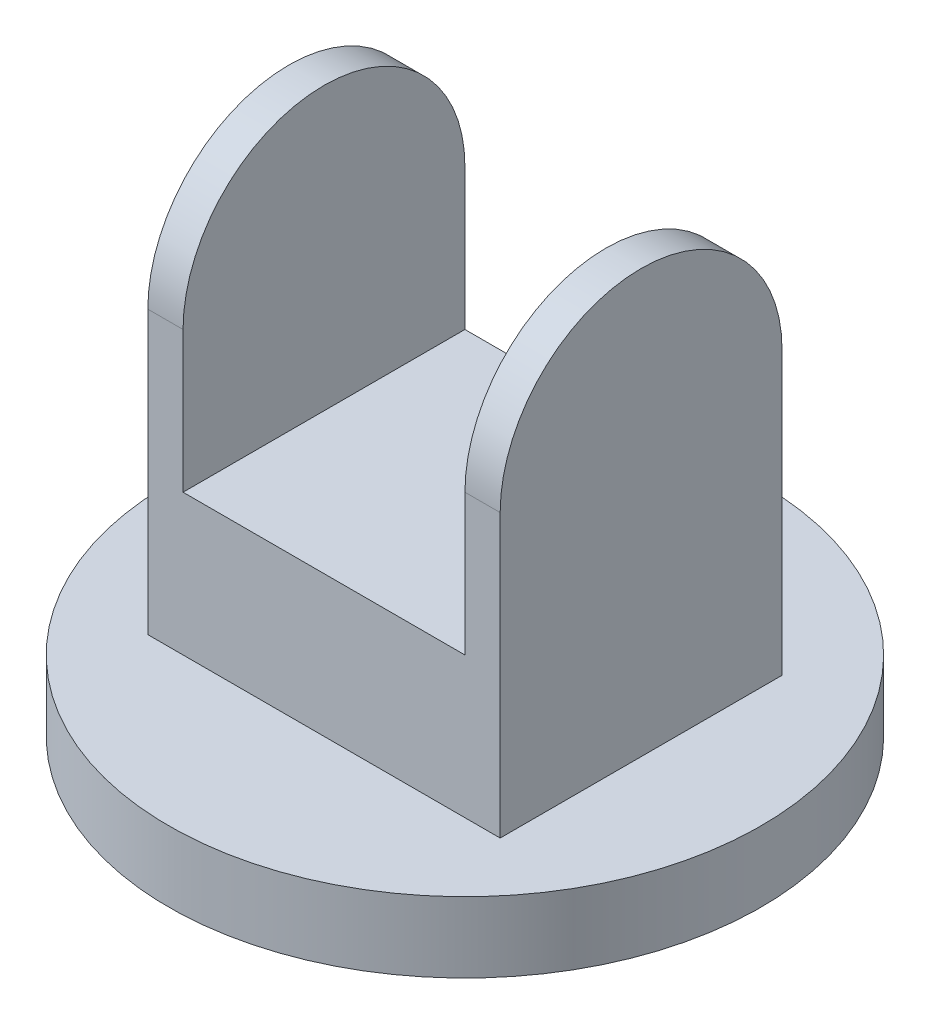
ISO-10303-21;
HEADER;
FILE_DESCRIPTION(('STEP AP214'),'2;1');
FILE_NAME('part.step','',(''),(''),'','','');
FILE_SCHEMA(('AUTOMOTIVE_DESIGN { 1 0 10303 214 1 1 1 1 }'));
ENDSEC;
DATA;
#1=APPLICATION_CONTEXT('core data for automotive mechanical design processes');
#2=APPLICATION_PROTOCOL_DEFINITION('international standard','automotive_design',2000,#1);
#3=PRODUCT_CONTEXT('',#1,'mechanical');
#4=PRODUCT('Part','Part','',(#3));
#5=PRODUCT_RELATED_PRODUCT_CATEGORY('part','',(#4));
#6=PRODUCT_DEFINITION_FORMATION('','',#4);
#7=PRODUCT_DEFINITION_CONTEXT('part definition',#1,'design');
#8=PRODUCT_DEFINITION('design','',#6,#7);
#9=PRODUCT_DEFINITION_SHAPE('','',#8);
#10=(LENGTH_UNIT() NAMED_UNIT(*) SI_UNIT(.MILLI.,.METRE.));
#11=(NAMED_UNIT(*) PLANE_ANGLE_UNIT() SI_UNIT($,.RADIAN.));
#12=(NAMED_UNIT(*) SI_UNIT($,.STERADIAN.) SOLID_ANGLE_UNIT());
#13=UNCERTAINTY_MEASURE_WITH_UNIT(LENGTH_MEASURE(1.E-05),#10,'distance_accuracy_value','');
#14=(GEOMETRIC_REPRESENTATION_CONTEXT(3) GLOBAL_UNCERTAINTY_ASSIGNED_CONTEXT((#13)) GLOBAL_UNIT_ASSIGNED_CONTEXT((#10,
#11,#12)) REPRESENTATION_CONTEXT('',''));
#15=CARTESIAN_POINT('',(0.,0.,0.));
#16=DIRECTION('',(0.,0.,1.));
#17=DIRECTION('',(1.,0.,0.));
#18=AXIS2_PLACEMENT_3D('',#15,#16,#17);
#19=CARTESIAN_POINT('',(100.,40.,0.));
#20=DIRECTION('',(-1.,0.,0.));
#21=DIRECTION('',(0.,0.,1.));
#22=AXIS2_PLACEMENT_3D('',#19,#20,#21);
#23=CYLINDRICAL_SURFACE('',#22,40.);
#24=CARTESIAN_POINT('',(90.,40.,0.));
#25=DIRECTION('',(1.,0.,0.));
#26=DIRECTION('',(0.,1.,0.));
#27=AXIS2_PLACEMENT_3D('',#24,#25,#26);
#28=CIRCLE('',#27,40.);
#29=CARTESIAN_POINT('',(90.,40.,-40.));
#30=VERTEX_POINT('',#29);
#31=CARTESIAN_POINT('',(90.,40.,40.));
#32=VERTEX_POINT('',#31);
#33=EDGE_CURVE('E138',#30,#32,#28,.T.);
#34=ORIENTED_EDGE('',*,*,#33,.T.);
#35=DIRECTION('',(-1.,0.,0.));
#36=VECTOR('',#35,1.);
#37=CARTESIAN_POINT('',(100.,40.,40.));
#38=LINE('',#37,#36);
#39=CARTESIAN_POINT('',(100.,40.,40.));
#40=VERTEX_POINT('',#39);
#41=EDGE_CURVE('E171',#40,#32,#38,.T.);
#42=ORIENTED_EDGE('',*,*,#41,.F.);
#43=CARTESIAN_POINT('',(100.,40.,0.));
#44=DIRECTION('',(1.,0.,0.));
#45=DIRECTION('',(0.,0.,-1.));
#46=AXIS2_PLACEMENT_3D('',#43,#44,#45);
#47=CIRCLE('',#46,40.);
#48=CARTESIAN_POINT('',(100.,40.,-40.));
#49=VERTEX_POINT('',#48);
#50=EDGE_CURVE('E86',#49,#40,#47,.T.);
#51=ORIENTED_EDGE('',*,*,#50,.F.);
#52=DIRECTION('',(-1.,0.,0.));
#53=VECTOR('',#52,1.);
#54=CARTESIAN_POINT('',(100.,40.,-40.));
#55=LINE('',#54,#53);
#56=EDGE_CURVE('E45',#49,#30,#55,.T.);
#57=ORIENTED_EDGE('',*,*,#56,.T.);
#58=EDGE_LOOP('',(#34,#42,#51,#57));
#59=FACE_BOUND('',#58,.T.);
#60=ADVANCED_FACE('F37',(#59),#23,.T.);
#61=CARTESIAN_POINT('',(100.,40.,-40.));
#62=DIRECTION('',(0.,0.,1.));
#63=DIRECTION('',(0.,-1.,0.));
#64=AXIS2_PLACEMENT_3D('',#61,#62,#63);
#65=PLANE('',#64);
#66=DIRECTION('',(1.,0.,0.));
#67=VECTOR('',#66,1.);
#68=CARTESIAN_POINT('',(100.,0.,-40.));
#69=LINE('',#68,#67);
#70=CARTESIAN_POINT('',(10.,0.,-40.));
#71=VERTEX_POINT('',#70);
#72=CARTESIAN_POINT('',(90.,0.,-40.));
#73=VERTEX_POINT('',#72);
#74=EDGE_CURVE('E119',#71,#73,#69,.T.);
#75=ORIENTED_EDGE('',*,*,#74,.T.);
#76=DIRECTION('',(0.,1.,0.));
#77=VECTOR('',#76,1.);
#78=CARTESIAN_POINT('',(90.,40.,-40.));
#79=LINE('',#78,#77);
#80=EDGE_CURVE('E140',#73,#30,#79,.T.);
#81=ORIENTED_EDGE('',*,*,#80,.T.);
#82=ORIENTED_EDGE('',*,*,#56,.F.);
#83=DIRECTION('',(0.,1.,0.));
#84=VECTOR('',#83,1.);
#85=CARTESIAN_POINT('',(100.,40.,-40.));
#86=LINE('',#85,#84);
#87=CARTESIAN_POINT('',(100.,-40.,-40.));
#88=VERTEX_POINT('',#87);
#89=EDGE_CURVE('E150',#88,#49,#86,.T.);
#90=ORIENTED_EDGE('',*,*,#89,.F.);
#91=DIRECTION('',(-1.,0.,0.));
#92=VECTOR('',#91,1.);
#93=CARTESIAN_POINT('',(100.,-40.,-40.));
#94=LINE('',#93,#92);
#95=CARTESIAN_POINT('',(0.,-40.,-40.));
#96=VERTEX_POINT('',#95);
#97=EDGE_CURVE('E78',#88,#96,#94,.T.);
#98=ORIENTED_EDGE('',*,*,#97,.T.);
#99=DIRECTION('',(0.,1.,0.));
#100=VECTOR('',#99,1.);
#101=CARTESIAN_POINT('',(0.,40.,-40.));
#102=LINE('',#101,#100);
#103=CARTESIAN_POINT('',(0.,40.,-40.));
#104=VERTEX_POINT('',#103);
#105=EDGE_CURVE('E147',#96,#104,#102,.T.);
#106=ORIENTED_EDGE('',*,*,#105,.T.);
#107=CARTESIAN_POINT('',(9.99999999999999,40.,-40.));
#108=VERTEX_POINT('',#107);
#109=EDGE_CURVE('E172',#108,#104,#55,.T.);
#110=ORIENTED_EDGE('',*,*,#109,.F.);
#111=DIRECTION('',(0.,-1.,0.));
#112=VECTOR('',#111,1.);
#113=CARTESIAN_POINT('',(9.99999999999999,40.,-40.));
#114=LINE('',#113,#112);
#115=EDGE_CURVE('E135',#108,#71,#114,.T.);
#116=ORIENTED_EDGE('',*,*,#115,.T.);
#117=EDGE_LOOP('',(#75,#81,#82,#90,#98,#106,#110,#116));
#118=FACE_BOUND('',#117,.T.);
#119=ADVANCED_FACE('F39',(#118),#65,.F.);
#120=CARTESIAN_POINT('',(9.99999999999999,40.,40.));
#121=VERTEX_POINT('',#120);
#122=CARTESIAN_POINT('',(0.,40.,40.));
#123=VERTEX_POINT('',#122);
#124=EDGE_CURVE('E170',#121,#123,#38,.T.);
#125=ORIENTED_EDGE('',*,*,#124,.F.);
#126=CARTESIAN_POINT('',(9.99999999999999,40.,0.));
#127=DIRECTION('',(-1.,0.,0.));
#128=DIRECTION('',(0.,0.,1.));
#129=AXIS2_PLACEMENT_3D('',#126,#127,#128);
#130=CIRCLE('',#129,40.);
#131=EDGE_CURVE('E52',#121,#108,#130,.T.);
#132=ORIENTED_EDGE('',*,*,#131,.T.);
#133=ORIENTED_EDGE('',*,*,#109,.T.);
#134=CARTESIAN_POINT('',(0.,40.,0.));
#135=DIRECTION('',(1.,0.,0.));
#136=DIRECTION('',(0.,0.,-1.));
#137=AXIS2_PLACEMENT_3D('',#134,#135,#136);
#138=CIRCLE('',#137,40.);
#139=EDGE_CURVE('E158',#104,#123,#138,.T.);
#140=ORIENTED_EDGE('',*,*,#139,.T.);
#141=EDGE_LOOP('',(#125,#132,#133,#140));
#142=FACE_BOUND('',#141,.T.);
#143=ADVANCED_FACE('F177',(#142),#23,.T.);
#144=CARTESIAN_POINT('',(100.,40.,40.));
#145=DIRECTION('',(0.,0.,-1.));
#146=DIRECTION('',(0.,1.,0.));
#147=AXIS2_PLACEMENT_3D('',#144,#145,#146);
#148=PLANE('',#147);
#149=ORIENTED_EDGE('',*,*,#41,.T.);
#150=DIRECTION('',(0.,1.,0.));
#151=VECTOR('',#150,1.);
#152=CARTESIAN_POINT('',(90.,0.,40.));
#153=LINE('',#152,#151);
#154=CARTESIAN_POINT('',(90.,0.,40.));
#155=VERTEX_POINT('',#154);
#156=EDGE_CURVE('E129',#155,#32,#153,.T.);
#157=ORIENTED_EDGE('',*,*,#156,.F.);
#158=DIRECTION('',(1.,0.,0.));
#159=VECTOR('',#158,1.);
#160=CARTESIAN_POINT('',(10.,0.,40.));
#161=LINE('',#160,#159);
#162=CARTESIAN_POINT('',(10.,0.,40.));
#163=VERTEX_POINT('',#162);
#164=EDGE_CURVE('E116',#163,#155,#161,.T.);
#165=ORIENTED_EDGE('',*,*,#164,.F.);
#166=DIRECTION('',(0.,1.,0.));
#167=VECTOR('',#166,1.);
#168=CARTESIAN_POINT('',(9.99999999999999,40.,40.));
#169=LINE('',#168,#167);
#170=EDGE_CURVE('E11',#163,#121,#169,.T.);
#171=ORIENTED_EDGE('',*,*,#170,.T.);
#172=ORIENTED_EDGE('',*,*,#124,.T.);
#173=DIRECTION('',(0.,-1.,0.));
#174=VECTOR('',#173,1.);
#175=CARTESIAN_POINT('',(0.,40.,40.));
#176=LINE('',#175,#174);
#177=CARTESIAN_POINT('',(0.,-40.,40.));
#178=VERTEX_POINT('',#177);
#179=EDGE_CURVE('E161',#123,#178,#176,.T.);
#180=ORIENTED_EDGE('',*,*,#179,.T.);
#181=DIRECTION('',(-1.,0.,0.));
#182=VECTOR('',#181,1.);
#183=CARTESIAN_POINT('',(100.,-40.,40.));
#184=LINE('',#183,#182);
#185=CARTESIAN_POINT('',(100.,-40.,40.));
#186=VERTEX_POINT('',#185);
#187=EDGE_CURVE('E167',#186,#178,#184,.T.);
#188=ORIENTED_EDGE('',*,*,#187,.F.);
#189=DIRECTION('',(0.,-1.,0.));
#190=VECTOR('',#189,1.);
#191=CARTESIAN_POINT('',(100.,40.,40.));
#192=LINE('',#191,#190);
#193=EDGE_CURVE('E154',#40,#186,#192,.T.);
#194=ORIENTED_EDGE('',*,*,#193,.F.);
#195=EDGE_LOOP('',(#149,#157,#165,#171,#172,#180,#188,#194));
#196=FACE_BOUND('',#195,.T.);
#197=ADVANCED_FACE('F127',(#196),#148,.F.);
#198=CARTESIAN_POINT('',(100.,40.,0.));
#199=DIRECTION('',(1.,0.,0.));
#200=DIRECTION('',(0.,0.,-1.));
#201=AXIS2_PLACEMENT_3D('',#198,#199,#200);
#202=PLANE('',#201);
#203=ORIENTED_EDGE('',*,*,#89,.T.);
#204=ORIENTED_EDGE('',*,*,#50,.T.);
#205=ORIENTED_EDGE('',*,*,#193,.T.);
#206=DIRECTION('',(0.,0.,-1.));
#207=VECTOR('',#206,1.);
#208=CARTESIAN_POINT('',(100.,-40.,40.));
#209=LINE('',#208,#207);
#210=EDGE_CURVE('E60',#186,#88,#209,.T.);
#211=ORIENTED_EDGE('',*,*,#210,.T.);
#212=EDGE_LOOP('',(#203,#204,#205,#211));
#213=FACE_BOUND('',#212,.T.);
#214=ADVANCED_FACE('F191',(#213),#202,.T.);
#215=CARTESIAN_POINT('',(0.,40.,0.));
#216=DIRECTION('',(1.,0.,0.));
#217=DIRECTION('',(0.,0.,-1.));
#218=AXIS2_PLACEMENT_3D('',#215,#216,#217);
#219=PLANE('',#218);
#220=ORIENTED_EDGE('',*,*,#105,.F.);
#221=DIRECTION('',(0.,0.,-1.));
#222=VECTOR('',#221,1.);
#223=CARTESIAN_POINT('',(0.,-40.,40.));
#224=LINE('',#223,#222);
#225=EDGE_CURVE('E152',#178,#96,#224,.T.);
#226=ORIENTED_EDGE('',*,*,#225,.F.);
#227=ORIENTED_EDGE('',*,*,#179,.F.);
#228=ORIENTED_EDGE('',*,*,#139,.F.);
#229=EDGE_LOOP('',(#220,#226,#227,#228));
#230=FACE_BOUND('',#229,.T.);
#231=ADVANCED_FACE('F180',(#230),#219,.F.);
#232=CARTESIAN_POINT('',(50.,-40.,0.));
#233=DIRECTION('',(0.,-1.,0.));
#234=DIRECTION('',(0.,0.,-1.));
#235=AXIS2_PLACEMENT_3D('',#232,#233,#234);
#236=PLANE('',#235);
#237=CARTESIAN_POINT('',(50.,-40.,0.));
#238=DIRECTION('',(0.,-1.,0.));
#239=DIRECTION('',(0.,0.,-1.));
#240=AXIS2_PLACEMENT_3D('',#237,#238,#239);
#241=CIRCLE('',#240,84.0312423743285);
#242=CARTESIAN_POINT('',(50.,-40.,-84.0312423743285));
#243=VERTEX_POINT('',#242);
#244=EDGE_CURVE('E143',#243,#243,#241,.T.);
#245=ORIENTED_EDGE('',*,*,#244,.F.);
#246=EDGE_LOOP('',(#245));
#247=FACE_BOUND('',#246,.T.);
#248=ORIENTED_EDGE('',*,*,#187,.T.);
#249=ORIENTED_EDGE('',*,*,#225,.T.);
#250=ORIENTED_EDGE('',*,*,#97,.F.);
#251=ORIENTED_EDGE('',*,*,#210,.F.);
#252=EDGE_LOOP('',(#248,#249,#250,#251));
#253=FACE_BOUND('',#252,.T.);
#254=ADVANCED_FACE('F194',(#247,#253),#236,.F.);
#255=CARTESIAN_POINT('',(50.,-60.,0.));
#256=DIRECTION('',(0.,1.,0.));
#257=DIRECTION('',(0.,0.,1.));
#258=AXIS2_PLACEMENT_3D('',#255,#256,#257);
#259=CYLINDRICAL_SURFACE('',#258,84.0312423743285);
#260=CARTESIAN_POINT('',(50.,-60.,0.));
#261=DIRECTION('',(0.,-1.,0.));
#262=DIRECTION('',(0.,0.,-1.));
#263=AXIS2_PLACEMENT_3D('',#260,#261,#262);
#264=CIRCLE('',#263,84.0312423743285);
#265=CARTESIAN_POINT('',(50.,-60.,-84.0312423743285));
#266=VERTEX_POINT('',#265);
#267=EDGE_CURVE('E144',#266,#266,#264,.T.);
#268=ORIENTED_EDGE('',*,*,#267,.F.);
#269=EDGE_LOOP('',(#268));
#270=FACE_BOUND('',#269,.T.);
#271=ORIENTED_EDGE('',*,*,#244,.T.);
#272=EDGE_LOOP('',(#271));
#273=FACE_BOUND('',#272,.T.);
#274=ADVANCED_FACE('F197',(#270,#273),#259,.T.);
#275=CARTESIAN_POINT('',(50.,-60.,0.));
#276=DIRECTION('',(0.,-1.,0.));
#277=DIRECTION('',(0.,0.,-1.));
#278=AXIS2_PLACEMENT_3D('',#275,#276,#277);
#279=PLANE('',#278);
#280=ORIENTED_EDGE('',*,*,#267,.T.);
#281=EDGE_LOOP('',(#280));
#282=FACE_BOUND('',#281,.T.);
#283=ADVANCED_FACE('F200',(#282),#279,.T.);
#284=CARTESIAN_POINT('',(90.,0.,-84.0312423743285));
#285=DIRECTION('',(1.,0.,0.));
#286=DIRECTION('',(0.,1.,0.));
#287=AXIS2_PLACEMENT_3D('',#284,#285,#286);
#288=PLANE('',#287);
#289=DIRECTION('',(0.,0.,1.));
#290=VECTOR('',#289,1.);
#291=CARTESIAN_POINT('',(90.,0.,-84.0312423743285));
#292=LINE('',#291,#290);
#293=EDGE_CURVE('E121',#73,#155,#292,.T.);
#294=ORIENTED_EDGE('',*,*,#293,.T.);
#295=ORIENTED_EDGE('',*,*,#156,.T.);
#296=ORIENTED_EDGE('',*,*,#33,.F.);
#297=ORIENTED_EDGE('',*,*,#80,.F.);
#298=EDGE_LOOP('',(#294,#295,#296,#297));
#299=FACE_BOUND('',#298,.T.);
#300=ADVANCED_FACE('F207',(#299),#288,.F.);
#301=CARTESIAN_POINT('',(10.,0.,-84.0312423743285));
#302=DIRECTION('',(0.,-1.,0.));
#303=DIRECTION('',(0.,0.,-1.));
#304=AXIS2_PLACEMENT_3D('',#301,#302,#303);
#305=PLANE('',#304);
#306=DIRECTION('',(0.,0.,1.));
#307=VECTOR('',#306,1.);
#308=CARTESIAN_POINT('',(10.,0.,-84.0312423743285));
#309=LINE('',#308,#307);
#310=EDGE_CURVE('E112',#71,#163,#309,.T.);
#311=ORIENTED_EDGE('',*,*,#310,.T.);
#312=ORIENTED_EDGE('',*,*,#164,.T.);
#313=ORIENTED_EDGE('',*,*,#293,.F.);
#314=ORIENTED_EDGE('',*,*,#74,.F.);
#315=EDGE_LOOP('',(#311,#312,#313,#314));
#316=FACE_BOUND('',#315,.T.);
#317=ADVANCED_FACE('F113',(#316),#305,.F.);
#318=CARTESIAN_POINT('',(10.,0.,-84.0312423743285));
#319=DIRECTION('',(-1.,0.,0.));
#320=DIRECTION('',(0.,0.,1.));
#321=AXIS2_PLACEMENT_3D('',#318,#319,#320);
#322=PLANE('',#321);
#323=ORIENTED_EDGE('',*,*,#131,.F.);
#324=ORIENTED_EDGE('',*,*,#170,.F.);
#325=ORIENTED_EDGE('',*,*,#310,.F.);
#326=ORIENTED_EDGE('',*,*,#115,.F.);
#327=EDGE_LOOP('',(#323,#324,#325,#326));
#328=FACE_BOUND('',#327,.T.);
#329=ADVANCED_FACE('F123',(#328),#322,.F.);
#330=CLOSED_SHELL('',(#60,#119,#143,#197,#214,#231,#254,#274,#283,#300,#317,#329));
#331=MANIFOLD_SOLID_BREP('B2',#330);
#332=ADVANCED_BREP_SHAPE_REPRESENTATION('',(#18,#331),#14);
#333=SHAPE_DEFINITION_REPRESENTATION(#9,#332);
ENDSEC;
END-ISO-10303-21;
